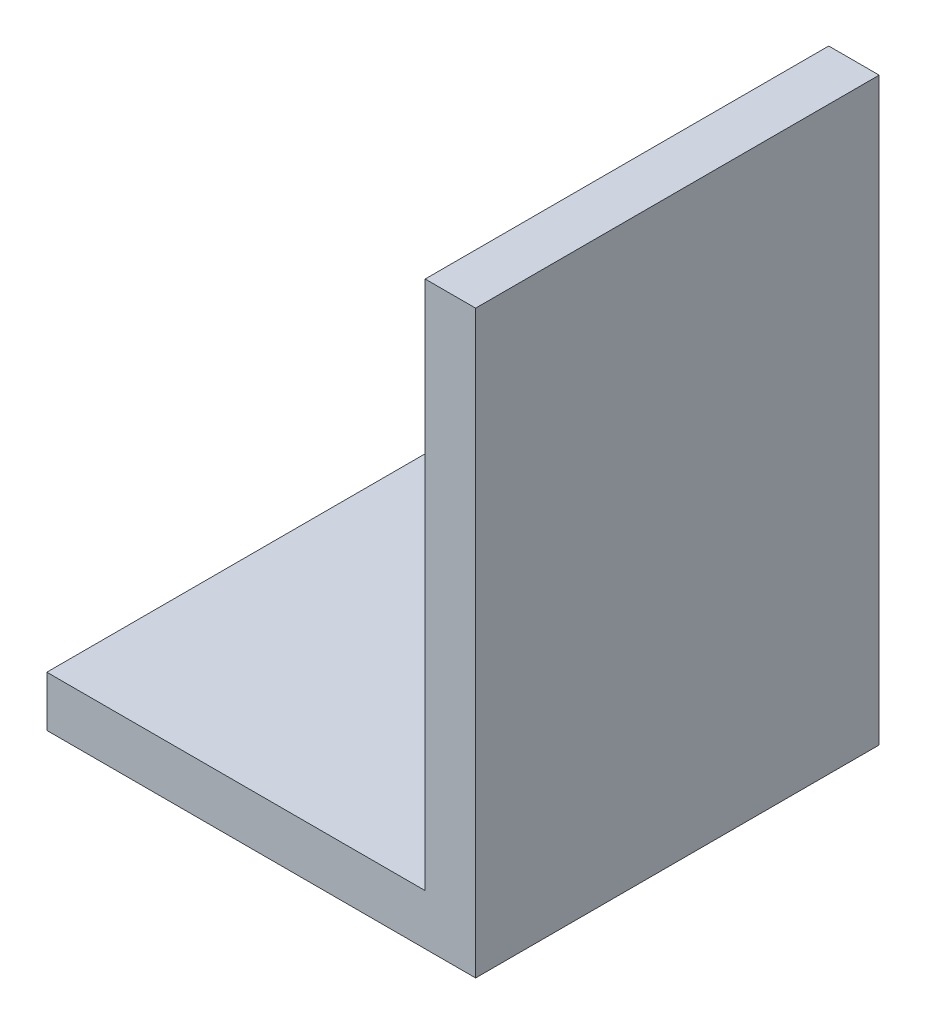
ISO-10303-21;
HEADER;
FILE_DESCRIPTION(('STEP AP214'),'2;1');
FILE_NAME('part.step','',(''),(''),'','','');
FILE_SCHEMA(('AUTOMOTIVE_DESIGN { 1 0 10303 214 1 1 1 1 }'));
ENDSEC;
DATA;
#1=APPLICATION_CONTEXT('core data for automotive mechanical design processes');
#2=APPLICATION_PROTOCOL_DEFINITION('international standard','automotive_design',2000,#1);
#3=PRODUCT_CONTEXT('',#1,'mechanical');
#4=PRODUCT('Part','Part','',(#3));
#5=PRODUCT_RELATED_PRODUCT_CATEGORY('part','',(#4));
#6=PRODUCT_DEFINITION_FORMATION('','',#4);
#7=PRODUCT_DEFINITION_CONTEXT('part definition',#1,'design');
#8=PRODUCT_DEFINITION('design','',#6,#7);
#9=PRODUCT_DEFINITION_SHAPE('','',#8);
#10=(LENGTH_UNIT() NAMED_UNIT(*) SI_UNIT(.MILLI.,.METRE.));
#11=(NAMED_UNIT(*) PLANE_ANGLE_UNIT() SI_UNIT($,.RADIAN.));
#12=(NAMED_UNIT(*) SI_UNIT($,.STERADIAN.) SOLID_ANGLE_UNIT());
#13=UNCERTAINTY_MEASURE_WITH_UNIT(LENGTH_MEASURE(1.E-05),#10,'distance_accuracy_value','');
#14=(GEOMETRIC_REPRESENTATION_CONTEXT(3) GLOBAL_UNCERTAINTY_ASSIGNED_CONTEXT((#13)) GLOBAL_UNIT_ASSIGNED_CONTEXT((#10,
#11,#12)) REPRESENTATION_CONTEXT('',''));
#15=CARTESIAN_POINT('',(0.,0.,0.));
#16=DIRECTION('',(0.,0.,1.));
#17=DIRECTION('',(1.,0.,0.));
#18=AXIS2_PLACEMENT_3D('',#15,#16,#17);
#19=CARTESIAN_POINT('',(126.,9.,16.));
#20=DIRECTION('',(1.,0.,0.));
#21=DIRECTION('',(0.,0.,-1.));
#22=AXIS2_PLACEMENT_3D('',#19,#20,#21);
#23=PLANE('',#22);
#24=DIRECTION('',(0.,-1.,0.));
#25=VECTOR('',#24,1.);
#26=CARTESIAN_POINT('',(126.,9.,0.));
#27=LINE('',#26,#25);
#28=CARTESIAN_POINT('',(126.,9.,0.));
#29=VERTEX_POINT('',#28);
#30=CARTESIAN_POINT('',(126.,7.,0.));
#31=VERTEX_POINT('',#30);
#32=EDGE_CURVE('E135',#29,#31,#27,.T.);
#33=ORIENTED_EDGE('',*,*,#32,.T.);
#34=DIRECTION('',(0.,0.,-1.));
#35=VECTOR('',#34,1.);
#36=CARTESIAN_POINT('',(126.,7.,16.));
#37=LINE('',#36,#35);
#38=CARTESIAN_POINT('',(126.,7.,16.));
#39=VERTEX_POINT('',#38);
#40=EDGE_CURVE('E11',#39,#31,#37,.T.);
#41=ORIENTED_EDGE('',*,*,#40,.F.);
#42=DIRECTION('',(0.,-1.,0.));
#43=VECTOR('',#42,1.);
#44=CARTESIAN_POINT('',(126.,9.,16.));
#45=LINE('',#44,#43);
#46=CARTESIAN_POINT('',(126.,9.,16.));
#47=VERTEX_POINT('',#46);
#48=EDGE_CURVE('E150',#47,#39,#45,.T.);
#49=ORIENTED_EDGE('',*,*,#48,.F.);
#50=DIRECTION('',(0.,0.,-1.));
#51=VECTOR('',#50,1.);
#52=CARTESIAN_POINT('',(126.,9.,16.));
#53=LINE('',#52,#51);
#54=EDGE_CURVE('E131',#47,#29,#53,.T.);
#55=ORIENTED_EDGE('',*,*,#54,.T.);
#56=EDGE_LOOP('',(#33,#41,#49,#55));
#57=FACE_BOUND('',#56,.T.);
#58=ADVANCED_FACE('F45',(#57),#23,.F.);
#59=CARTESIAN_POINT('',(126.,7.,16.));
#60=DIRECTION('',(0.,1.,0.));
#61=DIRECTION('',(0.,0.,1.));
#62=AXIS2_PLACEMENT_3D('',#59,#60,#61);
#63=PLANE('',#62);
#64=DIRECTION('',(1.,0.,0.));
#65=VECTOR('',#64,1.);
#66=CARTESIAN_POINT('',(126.,7.,0.));
#67=LINE('',#66,#65);
#68=CARTESIAN_POINT('',(143.,7.,0.));
#69=VERTEX_POINT('',#68);
#70=EDGE_CURVE('E139',#31,#69,#67,.T.);
#71=ORIENTED_EDGE('',*,*,#70,.T.);
#72=DIRECTION('',(0.,0.,-1.));
#73=VECTOR('',#72,1.);
#74=CARTESIAN_POINT('',(143.,7.,16.));
#75=LINE('',#74,#73);
#76=CARTESIAN_POINT('',(143.,7.,16.));
#77=VERTEX_POINT('',#76);
#78=EDGE_CURVE('E54',#77,#69,#75,.T.);
#79=ORIENTED_EDGE('',*,*,#78,.F.);
#80=DIRECTION('',(1.,0.,0.));
#81=VECTOR('',#80,1.);
#82=CARTESIAN_POINT('',(126.,7.,16.));
#83=LINE('',#82,#81);
#84=EDGE_CURVE('E99',#39,#77,#83,.T.);
#85=ORIENTED_EDGE('',*,*,#84,.F.);
#86=ORIENTED_EDGE('',*,*,#40,.T.);
#87=EDGE_LOOP('',(#71,#79,#85,#86));
#88=FACE_BOUND('',#87,.T.);
#89=ADVANCED_FACE('F177',(#88),#63,.F.);
#90=CARTESIAN_POINT('',(143.,7.,16.));
#91=DIRECTION('',(-1.,0.,0.));
#92=DIRECTION('',(0.,0.,1.));
#93=AXIS2_PLACEMENT_3D('',#90,#91,#92);
#94=PLANE('',#93);
#95=DIRECTION('',(0.,1.,0.));
#96=VECTOR('',#95,1.);
#97=CARTESIAN_POINT('',(143.,7.,0.));
#98=LINE('',#97,#96);
#99=CARTESIAN_POINT('',(143.,30.,0.));
#100=VERTEX_POINT('',#99);
#101=EDGE_CURVE('E141',#69,#100,#98,.T.);
#102=ORIENTED_EDGE('',*,*,#101,.T.);
#103=DIRECTION('',(0.,0.,-1.));
#104=VECTOR('',#103,1.);
#105=CARTESIAN_POINT('',(143.,30.,16.));
#106=LINE('',#105,#104);
#107=CARTESIAN_POINT('',(143.,30.,16.));
#108=VERTEX_POINT('',#107);
#109=EDGE_CURVE('E123',#108,#100,#106,.T.);
#110=ORIENTED_EDGE('',*,*,#109,.F.);
#111=DIRECTION('',(0.,1.,0.));
#112=VECTOR('',#111,1.);
#113=CARTESIAN_POINT('',(143.,7.,16.));
#114=LINE('',#113,#112);
#115=EDGE_CURVE('E112',#77,#108,#114,.T.);
#116=ORIENTED_EDGE('',*,*,#115,.F.);
#117=ORIENTED_EDGE('',*,*,#78,.T.);
#118=EDGE_LOOP('',(#102,#110,#116,#117));
#119=FACE_BOUND('',#118,.T.);
#120=ADVANCED_FACE('F160',(#119),#94,.F.);
#121=CARTESIAN_POINT('',(143.,30.,16.));
#122=DIRECTION('',(0.,-1.,0.));
#123=DIRECTION('',(0.,0.,-1.));
#124=AXIS2_PLACEMENT_3D('',#121,#122,#123);
#125=PLANE('',#124);
#126=DIRECTION('',(-1.,0.,0.));
#127=VECTOR('',#126,1.);
#128=CARTESIAN_POINT('',(143.,30.,0.));
#129=LINE('',#128,#127);
#130=CARTESIAN_POINT('',(141.,30.,0.));
#131=VERTEX_POINT('',#130);
#132=EDGE_CURVE('E121',#100,#131,#129,.T.);
#133=ORIENTED_EDGE('',*,*,#132,.T.);
#134=DIRECTION('',(0.,0.,-1.));
#135=VECTOR('',#134,1.);
#136=CARTESIAN_POINT('',(141.,30.,16.));
#137=LINE('',#136,#135);
#138=CARTESIAN_POINT('',(141.,30.,16.));
#139=VERTEX_POINT('',#138);
#140=EDGE_CURVE('E118',#139,#131,#137,.T.);
#141=ORIENTED_EDGE('',*,*,#140,.F.);
#142=DIRECTION('',(-1.,0.,0.));
#143=VECTOR('',#142,1.);
#144=CARTESIAN_POINT('',(143.,30.,16.));
#145=LINE('',#144,#143);
#146=EDGE_CURVE('E106',#108,#139,#145,.T.);
#147=ORIENTED_EDGE('',*,*,#146,.F.);
#148=ORIENTED_EDGE('',*,*,#109,.T.);
#149=EDGE_LOOP('',(#133,#141,#147,#148));
#150=FACE_BOUND('',#149,.T.);
#151=ADVANCED_FACE('F119',(#150),#125,.F.);
#152=CARTESIAN_POINT('',(141.,30.,16.));
#153=DIRECTION('',(1.,0.,0.));
#154=DIRECTION('',(0.,0.,-1.));
#155=AXIS2_PLACEMENT_3D('',#152,#153,#154);
#156=PLANE('',#155);
#157=DIRECTION('',(0.,-1.,0.));
#158=VECTOR('',#157,1.);
#159=CARTESIAN_POINT('',(141.,30.,0.));
#160=LINE('',#159,#158);
#161=CARTESIAN_POINT('',(141.,9.,0.));
#162=VERTEX_POINT('',#161);
#163=EDGE_CURVE('E85',#131,#162,#160,.T.);
#164=ORIENTED_EDGE('',*,*,#163,.T.);
#165=DIRECTION('',(0.,0.,-1.));
#166=VECTOR('',#165,1.);
#167=CARTESIAN_POINT('',(141.,9.,16.));
#168=LINE('',#167,#166);
#169=CARTESIAN_POINT('',(141.,9.,16.));
#170=VERTEX_POINT('',#169);
#171=EDGE_CURVE('E124',#170,#162,#168,.T.);
#172=ORIENTED_EDGE('',*,*,#171,.F.);
#173=DIRECTION('',(0.,-1.,0.));
#174=VECTOR('',#173,1.);
#175=CARTESIAN_POINT('',(141.,30.,16.));
#176=LINE('',#175,#174);
#177=EDGE_CURVE('E110',#139,#170,#176,.T.);
#178=ORIENTED_EDGE('',*,*,#177,.F.);
#179=ORIENTED_EDGE('',*,*,#140,.T.);
#180=EDGE_LOOP('',(#164,#172,#178,#179));
#181=FACE_BOUND('',#180,.T.);
#182=ADVANCED_FACE('F126',(#181),#156,.F.);
#183=CARTESIAN_POINT('',(141.,9.,16.));
#184=DIRECTION('',(0.,-1.,0.));
#185=DIRECTION('',(0.,0.,-1.));
#186=AXIS2_PLACEMENT_3D('',#183,#184,#185);
#187=PLANE('',#186);
#188=DIRECTION('',(-1.,0.,0.));
#189=VECTOR('',#188,1.);
#190=CARTESIAN_POINT('',(141.,9.,0.));
#191=LINE('',#190,#189);
#192=EDGE_CURVE('E91',#162,#29,#191,.T.);
#193=ORIENTED_EDGE('',*,*,#192,.T.);
#194=ORIENTED_EDGE('',*,*,#54,.F.);
#195=DIRECTION('',(-1.,0.,0.));
#196=VECTOR('',#195,1.);
#197=CARTESIAN_POINT('',(141.,9.,16.));
#198=LINE('',#197,#196);
#199=EDGE_CURVE('E62',#170,#47,#198,.T.);
#200=ORIENTED_EDGE('',*,*,#199,.F.);
#201=ORIENTED_EDGE('',*,*,#171,.T.);
#202=EDGE_LOOP('',(#193,#194,#200,#201));
#203=FACE_BOUND('',#202,.T.);
#204=ADVANCED_FACE('F167',(#203),#187,.F.);
#205=CARTESIAN_POINT('',(0.,0.,16.));
#206=DIRECTION('',(0.,0.,1.));
#207=DIRECTION('',(1.,0.,0.));
#208=AXIS2_PLACEMENT_3D('',#205,#206,#207);
#209=PLANE('',#208);
#210=ORIENTED_EDGE('',*,*,#48,.T.);
#211=ORIENTED_EDGE('',*,*,#84,.T.);
#212=ORIENTED_EDGE('',*,*,#115,.T.);
#213=ORIENTED_EDGE('',*,*,#146,.T.);
#214=ORIENTED_EDGE('',*,*,#177,.T.);
#215=ORIENTED_EDGE('',*,*,#199,.T.);
#216=EDGE_LOOP('',(#210,#211,#212,#213,#214,#215));
#217=FACE_BOUND('',#216,.T.);
#218=ADVANCED_FACE('F108',(#217),#209,.T.);
#219=CARTESIAN_POINT('',(0.,0.,0.));
#220=DIRECTION('',(0.,0.,1.));
#221=DIRECTION('',(1.,0.,0.));
#222=AXIS2_PLACEMENT_3D('',#219,#220,#221);
#223=PLANE('',#222);
#224=ORIENTED_EDGE('',*,*,#32,.F.);
#225=ORIENTED_EDGE('',*,*,#192,.F.);
#226=ORIENTED_EDGE('',*,*,#163,.F.);
#227=ORIENTED_EDGE('',*,*,#132,.F.);
#228=ORIENTED_EDGE('',*,*,#101,.F.);
#229=ORIENTED_EDGE('',*,*,#70,.F.);
#230=EDGE_LOOP('',(#224,#225,#226,#227,#228,#229));
#231=FACE_BOUND('',#230,.T.);
#232=ADVANCED_FACE('F163',(#231),#223,.F.);
#233=CLOSED_SHELL('',(#58,#89,#120,#151,#182,#204,#218,#232));
#234=MANIFOLD_SOLID_BREP('B2',#233);
#235=ADVANCED_BREP_SHAPE_REPRESENTATION('',(#18,#234),#14);
#236=SHAPE_DEFINITION_REPRESENTATION(#9,#235);
ENDSEC;
END-ISO-10303-21;
